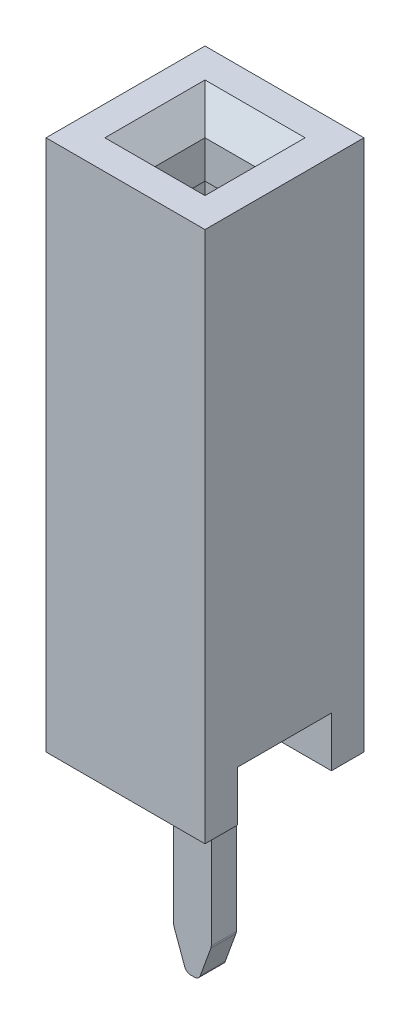
ISO-10303-21;
HEADER;
FILE_DESCRIPTION(('STEP AP214'),'2;1');
FILE_NAME('part.step','',(''),(''),'','','');
FILE_SCHEMA(('AUTOMOTIVE_DESIGN { 1 0 10303 214 1 1 1 1 }'));
ENDSEC;
DATA;
#1=APPLICATION_CONTEXT('core data for automotive mechanical design processes');
#2=APPLICATION_PROTOCOL_DEFINITION('international standard','automotive_design',2000,#1);
#3=PRODUCT_CONTEXT('',#1,'mechanical');
#4=PRODUCT('Part','Part','',(#3));
#5=PRODUCT_RELATED_PRODUCT_CATEGORY('part','',(#4));
#6=PRODUCT_DEFINITION_FORMATION('','',#4);
#7=PRODUCT_DEFINITION_CONTEXT('part definition',#1,'design');
#8=PRODUCT_DEFINITION('design','',#6,#7);
#9=PRODUCT_DEFINITION_SHAPE('','',#8);
#10=(LENGTH_UNIT() NAMED_UNIT(*) SI_UNIT(.MILLI.,.METRE.));
#11=(NAMED_UNIT(*) PLANE_ANGLE_UNIT() SI_UNIT($,.RADIAN.));
#12=(NAMED_UNIT(*) SI_UNIT($,.STERADIAN.) SOLID_ANGLE_UNIT());
#13=UNCERTAINTY_MEASURE_WITH_UNIT(LENGTH_MEASURE(1.E-05),#10,'distance_accuracy_value','');
#14=(GEOMETRIC_REPRESENTATION_CONTEXT(3) GLOBAL_UNCERTAINTY_ASSIGNED_CONTEXT((#13)) GLOBAL_UNIT_ASSIGNED_CONTEXT((#10,
#11,#12)) REPRESENTATION_CONTEXT('',''));
#15=CARTESIAN_POINT('',(0.,0.,0.));
#16=DIRECTION('',(0.,0.,1.));
#17=DIRECTION('',(1.,0.,0.));
#18=AXIS2_PLACEMENT_3D('',#15,#16,#17);
#19=CARTESIAN_POINT('',(0.3,-3.,-0.2));
#20=DIRECTION('',(1.,0.,0.));
#21=DIRECTION('',(0.,0.,-1.));
#22=AXIS2_PLACEMENT_3D('',#19,#20,#21);
#23=PLANE('',#22);
#24=DIRECTION('',(0.,1.,0.));
#25=VECTOR('',#24,1.);
#26=CARTESIAN_POINT('',(0.3,-3.,0.2));
#27=LINE('',#26,#25);
#28=CARTESIAN_POINT('',(0.3,-2.43287181803823,0.2));
#29=VERTEX_POINT('',#28);
#30=CARTESIAN_POINT('',(0.3,1.,0.2));
#31=VERTEX_POINT('',#30);
#32=EDGE_CURVE('E157',#29,#31,#27,.T.);
#33=ORIENTED_EDGE('',*,*,#32,.F.);
#34=DIRECTION('',(0.,0.,-1.));
#35=VECTOR('',#34,1.);
#36=CARTESIAN_POINT('',(0.3,-2.43287181803823,-0.2));
#37=LINE('',#36,#35);
#38=CARTESIAN_POINT('',(0.3,-2.43287181803823,-0.2));
#39=VERTEX_POINT('',#38);
#40=EDGE_CURVE('E55',#29,#39,#37,.T.);
#41=ORIENTED_EDGE('',*,*,#40,.T.);
#42=DIRECTION('',(0.,1.,0.));
#43=VECTOR('',#42,1.);
#44=CARTESIAN_POINT('',(0.3,-3.,-0.2));
#45=LINE('',#44,#43);
#46=CARTESIAN_POINT('',(0.3,1.,-0.2));
#47=VERTEX_POINT('',#46);
#48=EDGE_CURVE('E127',#39,#47,#45,.T.);
#49=ORIENTED_EDGE('',*,*,#48,.T.);
#50=DIRECTION('',(0.,0.,-1.));
#51=VECTOR('',#50,1.);
#52=CARTESIAN_POINT('',(0.3,1.,-0.2));
#53=LINE('',#52,#51);
#54=EDGE_CURVE('E130',#31,#47,#53,.T.);
#55=ORIENTED_EDGE('',*,*,#54,.F.);
#56=EDGE_LOOP('',(#33,#41,#49,#55));
#57=FACE_BOUND('',#56,.T.);
#58=ADVANCED_FACE('F47',(#57),#23,.T.);
#59=CARTESIAN_POINT('',(-0.3,-3.,0.2));
#60=DIRECTION('',(0.,0.,1.));
#61=DIRECTION('',(1.,0.,0.));
#62=AXIS2_PLACEMENT_3D('',#59,#60,#61);
#63=PLANE('',#62);
#64=DIRECTION('',(0.34202014332567,-0.939692620785908,0.));
#65=VECTOR('',#64,1.);
#66=CARTESIAN_POINT('',(-0.123395555688102,-2.93572123903135,0.2));
#67=LINE('',#66,#65);
#68=CARTESIAN_POINT('',(-0.293969262078591,-2.4670738323708,0.2));
#69=VERTEX_POINT('',#68);
#70=CARTESIAN_POINT('',(-0.12394850825762,-2.93420201433257,0.2));
#71=VERTEX_POINT('',#70);
#72=EDGE_CURVE('E164',#69,#71,#67,.T.);
#73=ORIENTED_EDGE('',*,*,#72,.T.);
#74=CARTESIAN_POINT('',(-0.0299792461790288,-2.9,0.2));
#75=DIRECTION('',(0.,0.,1.));
#76=DIRECTION('',(1.,0.,0.));
#77=AXIS2_PLACEMENT_3D('',#74,#75,#76);
#78=CIRCLE('',#77,0.1);
#79=CARTESIAN_POINT('',(-0.0299792461790288,-3.,0.2));
#80=VERTEX_POINT('',#79);
#81=EDGE_CURVE('E196',#71,#80,#78,.T.);
#82=ORIENTED_EDGE('',*,*,#81,.T.);
#83=DIRECTION('',(1.,0.,0.));
#84=VECTOR('',#83,1.);
#85=CARTESIAN_POINT('',(-0.3,-3.,0.2));
#86=LINE('',#85,#84);
#87=CARTESIAN_POINT('',(0.0299792461790288,-3.,0.2));
#88=VERTEX_POINT('',#87);
#89=EDGE_CURVE('E135',#80,#88,#86,.T.);
#90=ORIENTED_EDGE('',*,*,#89,.T.);
#91=CARTESIAN_POINT('',(0.0299792461790288,-2.9,0.2));
#92=DIRECTION('',(0.,0.,1.));
#93=DIRECTION('',(1.,0.,0.));
#94=AXIS2_PLACEMENT_3D('',#91,#92,#93);
#95=CIRCLE('',#94,0.1);
#96=CARTESIAN_POINT('',(0.12394850825762,-2.93420201433257,0.2));
#97=VERTEX_POINT('',#96);
#98=EDGE_CURVE('E194',#88,#97,#95,.T.);
#99=ORIENTED_EDGE('',*,*,#98,.T.);
#100=DIRECTION('',(0.34202014332567,0.939692620785908,0.));
#101=VECTOR('',#100,1.);
#102=CARTESIAN_POINT('',(0.0532088886237948,-3.12855752193731,0.2));
#103=LINE('',#102,#101);
#104=CARTESIAN_POINT('',(0.293969262078591,-2.4670738323708,0.2));
#105=VERTEX_POINT('',#104);
#106=EDGE_CURVE('E159',#97,#105,#103,.T.);
#107=ORIENTED_EDGE('',*,*,#106,.T.);
#108=CARTESIAN_POINT('',(0.2,-2.43287181803823,0.2));
#109=DIRECTION('',(0.,0.,1.));
#110=DIRECTION('',(1.,0.,0.));
#111=AXIS2_PLACEMENT_3D('',#108,#109,#110);
#112=CIRCLE('',#111,0.1);
#113=EDGE_CURVE('E62',#105,#29,#112,.T.);
#114=ORIENTED_EDGE('',*,*,#113,.T.);
#115=ORIENTED_EDGE('',*,*,#32,.T.);
#116=DIRECTION('',(1.,0.,0.));
#117=VECTOR('',#116,1.);
#118=CARTESIAN_POINT('',(-0.3,1.,0.2));
#119=LINE('',#118,#117);
#120=CARTESIAN_POINT('',(-0.3,1.,0.2));
#121=VERTEX_POINT('',#120);
#122=EDGE_CURVE('E149',#121,#31,#119,.T.);
#123=ORIENTED_EDGE('',*,*,#122,.F.);
#124=DIRECTION('',(0.,1.,0.));
#125=VECTOR('',#124,1.);
#126=CARTESIAN_POINT('',(-0.3,-3.,0.2));
#127=LINE('',#126,#125);
#128=CARTESIAN_POINT('',(-0.3,-2.43287181803823,0.2));
#129=VERTEX_POINT('',#128);
#130=EDGE_CURVE('E160',#129,#121,#127,.T.);
#131=ORIENTED_EDGE('',*,*,#130,.F.);
#132=CARTESIAN_POINT('',(-0.2,-2.43287181803823,0.2));
#133=DIRECTION('',(0.,0.,1.));
#134=DIRECTION('',(1.,0.,0.));
#135=AXIS2_PLACEMENT_3D('',#132,#133,#134);
#136=CIRCLE('',#135,0.1);
#137=EDGE_CURVE('E191',#129,#69,#136,.T.);
#138=ORIENTED_EDGE('',*,*,#137,.T.);
#139=EDGE_LOOP('',(#73,#82,#90,#99,#107,#114,#115,#123,#131,#138));
#140=FACE_BOUND('',#139,.T.);
#141=ADVANCED_FACE('F212',(#140),#63,.T.);
#142=CARTESIAN_POINT('',(-0.3,-3.,-0.2));
#143=DIRECTION('',(-1.,0.,0.));
#144=DIRECTION('',(0.,0.,1.));
#145=AXIS2_PLACEMENT_3D('',#142,#143,#144);
#146=PLANE('',#145);
#147=DIRECTION('',(0.,1.,0.));
#148=VECTOR('',#147,1.);
#149=CARTESIAN_POINT('',(-0.3,-3.,-0.2));
#150=LINE('',#149,#148);
#151=CARTESIAN_POINT('',(-0.3,-2.43287181803823,-0.2));
#152=VERTEX_POINT('',#151);
#153=CARTESIAN_POINT('',(-0.3,1.,-0.2));
#154=VERTEX_POINT('',#153);
#155=EDGE_CURVE('E134',#152,#154,#150,.T.);
#156=ORIENTED_EDGE('',*,*,#155,.F.);
#157=DIRECTION('',(0.,0.,1.));
#158=VECTOR('',#157,1.);
#159=CARTESIAN_POINT('',(-0.3,-2.43287181803823,-0.2));
#160=LINE('',#159,#158);
#161=EDGE_CURVE('E12',#152,#129,#160,.T.);
#162=ORIENTED_EDGE('',*,*,#161,.T.);
#163=ORIENTED_EDGE('',*,*,#130,.T.);
#164=DIRECTION('',(0.,0.,1.));
#165=VECTOR('',#164,1.);
#166=CARTESIAN_POINT('',(-0.3,1.,-0.2));
#167=LINE('',#166,#165);
#168=EDGE_CURVE('E145',#154,#121,#167,.T.);
#169=ORIENTED_EDGE('',*,*,#168,.F.);
#170=EDGE_LOOP('',(#156,#162,#163,#169));
#171=FACE_BOUND('',#170,.T.);
#172=ADVANCED_FACE('F237',(#171),#146,.T.);
#173=CARTESIAN_POINT('',(-0.3,-3.,-0.2));
#174=DIRECTION('',(0.,0.,-1.));
#175=DIRECTION('',(-1.,0.,0.));
#176=AXIS2_PLACEMENT_3D('',#173,#174,#175);
#177=PLANE('',#176);
#178=DIRECTION('',(-1.,0.,0.));
#179=VECTOR('',#178,1.);
#180=CARTESIAN_POINT('',(-0.3,-3.,-0.2));
#181=LINE('',#180,#179);
#182=CARTESIAN_POINT('',(0.0299792461790288,-3.,-0.2));
#183=VERTEX_POINT('',#182);
#184=CARTESIAN_POINT('',(-0.0299792461790288,-3.,-0.2));
#185=VERTEX_POINT('',#184);
#186=EDGE_CURVE('E156',#183,#185,#181,.T.);
#187=ORIENTED_EDGE('',*,*,#186,.T.);
#188=CARTESIAN_POINT('',(-0.0299792461790288,-2.9,-0.2));
#189=DIRECTION('',(0.,0.,-1.));
#190=DIRECTION('',(-1.,0.,0.));
#191=AXIS2_PLACEMENT_3D('',#188,#189,#190);
#192=CIRCLE('',#191,0.1);
#193=CARTESIAN_POINT('',(-0.12394850825762,-2.93420201433257,-0.2));
#194=VERTEX_POINT('',#193);
#195=EDGE_CURVE('E185',#185,#194,#192,.T.);
#196=ORIENTED_EDGE('',*,*,#195,.T.);
#197=DIRECTION('',(-0.34202014332567,0.939692620785908,0.));
#198=VECTOR('',#197,1.);
#199=CARTESIAN_POINT('',(-0.123395555688102,-2.93572123903135,-0.2));
#200=LINE('',#199,#198);
#201=CARTESIAN_POINT('',(-0.293969262078591,-2.4670738323708,-0.2));
#202=VERTEX_POINT('',#201);
#203=EDGE_CURVE('E170',#194,#202,#200,.T.);
#204=ORIENTED_EDGE('',*,*,#203,.T.);
#205=CARTESIAN_POINT('',(-0.2,-2.43287181803823,-0.2));
#206=DIRECTION('',(0.,0.,-1.));
#207=DIRECTION('',(-1.,0.,0.));
#208=AXIS2_PLACEMENT_3D('',#205,#206,#207);
#209=CIRCLE('',#208,0.1);
#210=EDGE_CURVE('E179',#202,#152,#209,.T.);
#211=ORIENTED_EDGE('',*,*,#210,.T.);
#212=ORIENTED_EDGE('',*,*,#155,.T.);
#213=DIRECTION('',(-1.,0.,0.));
#214=VECTOR('',#213,1.);
#215=CARTESIAN_POINT('',(-0.3,1.,-0.2));
#216=LINE('',#215,#214);
#217=EDGE_CURVE('E138',#47,#154,#216,.T.);
#218=ORIENTED_EDGE('',*,*,#217,.F.);
#219=ORIENTED_EDGE('',*,*,#48,.F.);
#220=CARTESIAN_POINT('',(0.2,-2.43287181803823,-0.2));
#221=DIRECTION('',(0.,0.,-1.));
#222=DIRECTION('',(-1.,0.,0.));
#223=AXIS2_PLACEMENT_3D('',#220,#221,#222);
#224=CIRCLE('',#223,0.1);
#225=CARTESIAN_POINT('',(0.293969262078591,-2.4670738323708,-0.2));
#226=VERTEX_POINT('',#225);
#227=EDGE_CURVE('E181',#39,#226,#224,.T.);
#228=ORIENTED_EDGE('',*,*,#227,.T.);
#229=DIRECTION('',(-0.34202014332567,-0.939692620785908,0.));
#230=VECTOR('',#229,1.);
#231=CARTESIAN_POINT('',(0.0532088886237948,-3.12855752193731,-0.2));
#232=LINE('',#231,#230);
#233=CARTESIAN_POINT('',(0.12394850825762,-2.93420201433257,-0.2));
#234=VERTEX_POINT('',#233);
#235=EDGE_CURVE('E167',#226,#234,#232,.T.);
#236=ORIENTED_EDGE('',*,*,#235,.T.);
#237=CARTESIAN_POINT('',(0.0299792461790288,-2.9,-0.2));
#238=DIRECTION('',(0.,0.,-1.));
#239=DIRECTION('',(-1.,0.,0.));
#240=AXIS2_PLACEMENT_3D('',#237,#238,#239);
#241=CIRCLE('',#240,0.1);
#242=EDGE_CURVE('E183',#234,#183,#241,.T.);
#243=ORIENTED_EDGE('',*,*,#242,.T.);
#244=EDGE_LOOP('',(#187,#196,#204,#211,#212,#218,#219,#228,#236,#243));
#245=FACE_BOUND('',#244,.T.);
#246=ADVANCED_FACE('F140',(#245),#177,.T.);
#247=CARTESIAN_POINT('',(0.,-3.,0.));
#248=DIRECTION('',(0.,1.,0.));
#249=DIRECTION('',(0.,0.,1.));
#250=AXIS2_PLACEMENT_3D('',#247,#248,#249);
#251=PLANE('',#250);
#252=ORIENTED_EDGE('',*,*,#89,.F.);
#253=DIRECTION('',(0.,0.,-1.));
#254=VECTOR('',#253,1.);
#255=CARTESIAN_POINT('',(-0.0299792461790288,-3.,-0.2));
#256=LINE('',#255,#254);
#257=EDGE_CURVE('E176',#80,#185,#256,.T.);
#258=ORIENTED_EDGE('',*,*,#257,.T.);
#259=ORIENTED_EDGE('',*,*,#186,.F.);
#260=DIRECTION('',(0.,0.,1.));
#261=VECTOR('',#260,1.);
#262=CARTESIAN_POINT('',(0.0299792461790288,-3.,0.2));
#263=LINE('',#262,#261);
#264=EDGE_CURVE('E173',#183,#88,#263,.T.);
#265=ORIENTED_EDGE('',*,*,#264,.T.);
#266=EDGE_LOOP('',(#252,#258,#259,#265));
#267=FACE_BOUND('',#266,.T.);
#268=ADVANCED_FACE('F210',(#267),#251,.F.);
#269=CARTESIAN_POINT('',(0.,1.,0.));
#270=DIRECTION('',(0.,1.,0.));
#271=DIRECTION('',(0.,0.,1.));
#272=AXIS2_PLACEMENT_3D('',#269,#270,#271);
#273=PLANE('',#272);
#274=ORIENTED_EDGE('',*,*,#54,.T.);
#275=ORIENTED_EDGE('',*,*,#217,.T.);
#276=ORIENTED_EDGE('',*,*,#168,.T.);
#277=ORIENTED_EDGE('',*,*,#122,.T.);
#278=EDGE_LOOP('',(#274,#275,#276,#277));
#279=FACE_BOUND('',#278,.T.);
#280=ADVANCED_FACE('F147',(#279),#273,.T.);
#281=CARTESIAN_POINT('',(-0.3,-2.45050451610908,-0.2));
#282=DIRECTION('',(-0.939692620785908,-0.34202014332567,0.));
#283=DIRECTION('',(0.,0.,-1.));
#284=AXIS2_PLACEMENT_3D('',#281,#282,#283);
#285=PLANE('',#284);
#286=ORIENTED_EDGE('',*,*,#203,.F.);
#287=DIRECTION('',(0.,0.,-1.));
#288=VECTOR('',#287,1.);
#289=CARTESIAN_POINT('',(-0.12394850825762,-2.93420201433257,0.2));
#290=LINE('',#289,#288);
#291=EDGE_CURVE('E189',#194,#71,#290,.F.);
#292=ORIENTED_EDGE('',*,*,#291,.T.);
#293=ORIENTED_EDGE('',*,*,#72,.F.);
#294=DIRECTION('',(0.,0.,1.));
#295=VECTOR('',#294,1.);
#296=CARTESIAN_POINT('',(-0.293969262078591,-2.4670738323708,-0.2));
#297=LINE('',#296,#295);
#298=EDGE_CURVE('E187',#69,#202,#297,.F.);
#299=ORIENTED_EDGE('',*,*,#298,.T.);
#300=EDGE_LOOP('',(#286,#292,#293,#299));
#301=FACE_BOUND('',#300,.T.);
#302=ADVANCED_FACE('F219',(#301),#285,.T.);
#303=CARTESIAN_POINT('',(0.3,-2.45050451610908,-0.2));
#304=DIRECTION('',(0.939692620785908,-0.34202014332567,0.));
#305=DIRECTION('',(0.,0.,1.));
#306=AXIS2_PLACEMENT_3D('',#303,#304,#305);
#307=PLANE('',#306);
#308=ORIENTED_EDGE('',*,*,#106,.F.);
#309=DIRECTION('',(0.,0.,1.));
#310=VECTOR('',#309,1.);
#311=CARTESIAN_POINT('',(0.12394850825762,-2.93420201433257,-0.2));
#312=LINE('',#311,#310);
#313=EDGE_CURVE('E199',#97,#234,#312,.F.);
#314=ORIENTED_EDGE('',*,*,#313,.T.);
#315=ORIENTED_EDGE('',*,*,#235,.F.);
#316=DIRECTION('',(0.,0.,-1.));
#317=VECTOR('',#316,1.);
#318=CARTESIAN_POINT('',(0.293969262078591,-2.4670738323708,-0.2));
#319=LINE('',#318,#317);
#320=EDGE_CURVE('E70',#226,#105,#319,.F.);
#321=ORIENTED_EDGE('',*,*,#320,.T.);
#322=EDGE_LOOP('',(#308,#314,#315,#321));
#323=FACE_BOUND('',#322,.T.);
#324=ADVANCED_FACE('F201',(#323),#307,.T.);
#325=CARTESIAN_POINT('',(-0.0299792461790288,-2.9,0.));
#326=DIRECTION('',(0.,0.,1.));
#327=DIRECTION('',(1.,0.,0.));
#328=AXIS2_PLACEMENT_3D('',#325,#326,#327);
#329=CYLINDRICAL_SURFACE('',#328,0.1);
#330=ORIENTED_EDGE('',*,*,#81,.F.);
#331=ORIENTED_EDGE('',*,*,#291,.F.);
#332=ORIENTED_EDGE('',*,*,#195,.F.);
#333=ORIENTED_EDGE('',*,*,#257,.F.);
#334=EDGE_LOOP('',(#330,#331,#332,#333));
#335=FACE_BOUND('',#334,.T.);
#336=ADVANCED_FACE('F222',(#335),#329,.T.);
#337=CARTESIAN_POINT('',(0.0299792461790288,-2.9,0.));
#338=DIRECTION('',(0.,0.,-1.));
#339=DIRECTION('',(-1.,0.,0.));
#340=AXIS2_PLACEMENT_3D('',#337,#338,#339);
#341=CYLINDRICAL_SURFACE('',#340,0.1);
#342=ORIENTED_EDGE('',*,*,#242,.F.);
#343=ORIENTED_EDGE('',*,*,#313,.F.);
#344=ORIENTED_EDGE('',*,*,#98,.F.);
#345=ORIENTED_EDGE('',*,*,#264,.F.);
#346=EDGE_LOOP('',(#342,#343,#344,#345));
#347=FACE_BOUND('',#346,.T.);
#348=ADVANCED_FACE('F206',(#347),#341,.T.);
#349=CARTESIAN_POINT('',(0.2,-2.43287181803823,-0.2));
#350=DIRECTION('',(0.,0.,-1.));
#351=DIRECTION('',(-1.,0.,0.));
#352=AXIS2_PLACEMENT_3D('',#349,#350,#351);
#353=CYLINDRICAL_SURFACE('',#352,0.1);
#354=ORIENTED_EDGE('',*,*,#113,.F.);
#355=ORIENTED_EDGE('',*,*,#320,.F.);
#356=ORIENTED_EDGE('',*,*,#227,.F.);
#357=ORIENTED_EDGE('',*,*,#40,.F.);
#358=EDGE_LOOP('',(#354,#355,#356,#357));
#359=FACE_BOUND('',#358,.T.);
#360=ADVANCED_FACE('F229',(#359),#353,.T.);
#361=CARTESIAN_POINT('',(-0.2,-2.43287181803823,-0.2));
#362=DIRECTION('',(0.,0.,1.));
#363=DIRECTION('',(1.,0.,0.));
#364=AXIS2_PLACEMENT_3D('',#361,#362,#363);
#365=CYLINDRICAL_SURFACE('',#364,0.1);
#366=ORIENTED_EDGE('',*,*,#210,.F.);
#367=ORIENTED_EDGE('',*,*,#298,.F.);
#368=ORIENTED_EDGE('',*,*,#137,.F.);
#369=ORIENTED_EDGE('',*,*,#161,.F.);
#370=EDGE_LOOP('',(#366,#367,#368,#369));
#371=FACE_BOUND('',#370,.T.);
#372=ADVANCED_FACE('F49',(#371),#365,.T.);
#373=CLOSED_SHELL('',(#58,#141,#172,#246,#268,#280,#302,#324,#336,#348,#360,#372));
#374=MANIFOLD_SOLID_BREP('B2',#373);
#375=CARTESIAN_POINT('',(0.,0.,0.));
#376=DIRECTION('',(0.,-1.,0.));
#377=DIRECTION('',(0.,0.,-1.));
#378=AXIS2_PLACEMENT_3D('',#375,#376,#377);
#379=PLANE('',#378);
#380=DIRECTION('',(1.,0.,0.));
#381=VECTOR('',#380,1.);
#382=CARTESIAN_POINT('',(-1.27,0.,-0.75));
#383=LINE('',#382,#381);
#384=CARTESIAN_POINT('',(-1.27,0.,-0.75));
#385=VERTEX_POINT('',#384);
#386=CARTESIAN_POINT('',(1.27,0.,-0.75));
#387=VERTEX_POINT('',#386);
#388=EDGE_CURVE('E490',#385,#387,#383,.T.);
#389=ORIENTED_EDGE('',*,*,#388,.F.);
#390=DIRECTION('',(0.,0.,1.));
#391=VECTOR('',#390,1.);
#392=CARTESIAN_POINT('',(-1.27,0.,1.27));
#393=LINE('',#392,#391);
#394=CARTESIAN_POINT('',(-1.27,0.,-1.27));
#395=VERTEX_POINT('',#394);
#396=EDGE_CURVE('E591',#395,#385,#393,.T.);
#397=ORIENTED_EDGE('',*,*,#396,.F.);
#398=DIRECTION('',(-1.,0.,0.));
#399=VECTOR('',#398,1.);
#400=CARTESIAN_POINT('',(-1.27,0.,-1.27));
#401=LINE('',#400,#399);
#402=CARTESIAN_POINT('',(1.27,0.,-1.27));
#403=VERTEX_POINT('',#402);
#404=EDGE_CURVE('E588',#403,#395,#401,.T.);
#405=ORIENTED_EDGE('',*,*,#404,.F.);
#406=DIRECTION('',(0.,0.,-1.));
#407=VECTOR('',#406,1.);
#408=CARTESIAN_POINT('',(1.27,0.,1.27));
#409=LINE('',#408,#407);
#410=EDGE_CURVE('E575',#387,#403,#409,.T.);
#411=ORIENTED_EDGE('',*,*,#410,.F.);
#412=EDGE_LOOP('',(#389,#397,#405,#411));
#413=FACE_BOUND('',#412,.T.);
#414=ADVANCED_FACE('F327',(#413),#379,.T.);
#415=CARTESIAN_POINT('',(0.4,1.,0.4));
#416=DIRECTION('',(1.,0.,0.));
#417=DIRECTION('',(0.,0.,-1.));
#418=AXIS2_PLACEMENT_3D('',#415,#416,#417);
#419=PLANE('',#418);
#420=DIRECTION('',(0.,0.,-1.));
#421=VECTOR('',#420,1.);
#422=CARTESIAN_POINT('',(0.4,7.5,0.4));
#423=LINE('',#422,#421);
#424=CARTESIAN_POINT('',(0.4,7.5,0.4));
#425=VERTEX_POINT('',#424);
#426=CARTESIAN_POINT('',(0.4,7.5,-0.4));
#427=VERTEX_POINT('',#426);
#428=EDGE_CURVE('E545',#425,#427,#423,.T.);
#429=ORIENTED_EDGE('',*,*,#428,.F.);
#430=DIRECTION('',(0.,1.,0.));
#431=VECTOR('',#430,1.);
#432=CARTESIAN_POINT('',(0.4,1.,0.4));
#433=LINE('',#432,#431);
#434=CARTESIAN_POINT('',(0.4,8.1,0.4));
#435=VERTEX_POINT('',#434);
#436=EDGE_CURVE('E548',#425,#435,#433,.T.);
#437=ORIENTED_EDGE('',*,*,#436,.T.);
#438=DIRECTION('',(0.,0.,-1.));
#439=VECTOR('',#438,1.);
#440=CARTESIAN_POINT('',(0.4,8.1,0.4));
#441=LINE('',#440,#439);
#442=CARTESIAN_POINT('',(0.4,8.1,-0.4));
#443=VERTEX_POINT('',#442);
#444=EDGE_CURVE('E607',#435,#443,#441,.T.);
#445=ORIENTED_EDGE('',*,*,#444,.T.);
#446=DIRECTION('',(0.,1.,0.));
#447=VECTOR('',#446,1.);
#448=CARTESIAN_POINT('',(0.4,1.,-0.4));
#449=LINE('',#448,#447);
#450=EDGE_CURVE('E555',#427,#443,#449,.T.);
#451=ORIENTED_EDGE('',*,*,#450,.F.);
#452=EDGE_LOOP('',(#429,#437,#445,#451));
#453=FACE_BOUND('',#452,.T.);
#454=ADVANCED_FACE('F675',(#453),#419,.F.);
#455=CARTESIAN_POINT('',(-0.4,1.,0.4));
#456=DIRECTION('',(0.,0.,1.));
#457=DIRECTION('',(1.,0.,0.));
#458=AXIS2_PLACEMENT_3D('',#455,#456,#457);
#459=PLANE('',#458);
#460=DIRECTION('',(1.,0.,0.));
#461=VECTOR('',#460,1.);
#462=CARTESIAN_POINT('',(-0.4,7.5,0.4));
#463=LINE('',#462,#461);
#464=CARTESIAN_POINT('',(-0.4,7.5,0.4));
#465=VERTEX_POINT('',#464);
#466=EDGE_CURVE('E543',#465,#425,#463,.T.);
#467=ORIENTED_EDGE('',*,*,#466,.F.);
#468=DIRECTION('',(0.,1.,0.));
#469=VECTOR('',#468,1.);
#470=CARTESIAN_POINT('',(-0.4,1.,0.4));
#471=LINE('',#470,#469);
#472=CARTESIAN_POINT('',(-0.4,8.1,0.4));
#473=VERTEX_POINT('',#472);
#474=EDGE_CURVE('E551',#465,#473,#471,.T.);
#475=ORIENTED_EDGE('',*,*,#474,.T.);
#476=DIRECTION('',(1.,0.,0.));
#477=VECTOR('',#476,1.);
#478=CARTESIAN_POINT('',(-0.4,8.1,0.4));
#479=LINE('',#478,#477);
#480=EDGE_CURVE('E619',#473,#435,#479,.T.);
#481=ORIENTED_EDGE('',*,*,#480,.T.);
#482=ORIENTED_EDGE('',*,*,#436,.F.);
#483=EDGE_LOOP('',(#467,#475,#481,#482));
#484=FACE_BOUND('',#483,.T.);
#485=ADVANCED_FACE('F673',(#484),#459,.F.);
#486=CARTESIAN_POINT('',(-0.4,1.,0.4));
#487=DIRECTION('',(-1.,0.,0.));
#488=DIRECTION('',(0.,0.,1.));
#489=AXIS2_PLACEMENT_3D('',#486,#487,#488);
#490=PLANE('',#489);
#491=DIRECTION('',(0.,0.,1.));
#492=VECTOR('',#491,1.);
#493=CARTESIAN_POINT('',(-0.4,7.5,0.4));
#494=LINE('',#493,#492);
#495=CARTESIAN_POINT('',(-0.4,7.5,-0.4));
#496=VERTEX_POINT('',#495);
#497=EDGE_CURVE('E541',#496,#465,#494,.T.);
#498=ORIENTED_EDGE('',*,*,#497,.F.);
#499=DIRECTION('',(0.,1.,0.));
#500=VECTOR('',#499,1.);
#501=CARTESIAN_POINT('',(-0.4,1.,-0.4));
#502=LINE('',#501,#500);
#503=CARTESIAN_POINT('',(-0.4,8.1,-0.4));
#504=VERTEX_POINT('',#503);
#505=EDGE_CURVE('E553',#496,#504,#502,.T.);
#506=ORIENTED_EDGE('',*,*,#505,.T.);
#507=DIRECTION('',(0.,0.,1.));
#508=VECTOR('',#507,1.);
#509=CARTESIAN_POINT('',(-0.4,8.1,0.4));
#510=LINE('',#509,#508);
#511=EDGE_CURVE('E622',#504,#473,#510,.T.);
#512=ORIENTED_EDGE('',*,*,#511,.T.);
#513=ORIENTED_EDGE('',*,*,#474,.F.);
#514=EDGE_LOOP('',(#498,#506,#512,#513));
#515=FACE_BOUND('',#514,.T.);
#516=ADVANCED_FACE('F647',(#515),#490,.F.);
#517=CARTESIAN_POINT('',(-0.4,1.,-0.4));
#518=DIRECTION('',(0.,0.,-1.));
#519=DIRECTION('',(-1.,0.,0.));
#520=AXIS2_PLACEMENT_3D('',#517,#518,#519);
#521=PLANE('',#520);
#522=DIRECTION('',(-1.,0.,0.));
#523=VECTOR('',#522,1.);
#524=CARTESIAN_POINT('',(-0.4,7.5,-0.4));
#525=LINE('',#524,#523);
#526=EDGE_CURVE('E335',#427,#496,#525,.T.);
#527=ORIENTED_EDGE('',*,*,#526,.F.);
#528=ORIENTED_EDGE('',*,*,#450,.T.);
#529=DIRECTION('',(-1.,0.,0.));
#530=VECTOR('',#529,1.);
#531=CARTESIAN_POINT('',(-0.4,8.1,-0.4));
#532=LINE('',#531,#530);
#533=EDGE_CURVE('E625',#443,#504,#532,.T.);
#534=ORIENTED_EDGE('',*,*,#533,.T.);
#535=ORIENTED_EDGE('',*,*,#505,.F.);
#536=EDGE_LOOP('',(#527,#528,#534,#535));
#537=FACE_BOUND('',#536,.T.);
#538=ADVANCED_FACE('F648',(#537),#521,.F.);
#539=CARTESIAN_POINT('',(0.,8.5,0.));
#540=DIRECTION('',(0.,-1.,0.));
#541=DIRECTION('',(0.,0.,-1.));
#542=AXIS2_PLACEMENT_3D('',#539,#540,#541);
#543=PLANE('',#542);
#544=DIRECTION('',(1.,0.,0.));
#545=VECTOR('',#544,1.);
#546=CARTESIAN_POINT('',(0.,8.5,-0.800000000000002));
#547=LINE('',#546,#545);
#548=CARTESIAN_POINT('',(-0.800000000000002,8.5,-0.800000000000002));
#549=VERTEX_POINT('',#548);
#550=CARTESIAN_POINT('',(0.800000000000002,8.5,-0.800000000000002));
#551=VERTEX_POINT('',#550);
#552=EDGE_CURVE('E610',#549,#551,#547,.T.);
#553=ORIENTED_EDGE('',*,*,#552,.T.);
#554=DIRECTION('',(0.,0.,1.));
#555=VECTOR('',#554,1.);
#556=CARTESIAN_POINT('',(0.800000000000002,8.5,0.));
#557=LINE('',#556,#555);
#558=CARTESIAN_POINT('',(0.800000000000002,8.5,0.800000000000002));
#559=VERTEX_POINT('',#558);
#560=EDGE_CURVE('E616',#551,#559,#557,.T.);
#561=ORIENTED_EDGE('',*,*,#560,.T.);
#562=DIRECTION('',(-1.,0.,0.));
#563=VECTOR('',#562,1.);
#564=CARTESIAN_POINT('',(0.,8.5,0.800000000000002));
#565=LINE('',#564,#563);
#566=CARTESIAN_POINT('',(-0.800000000000002,8.5,0.800000000000002));
#567=VERTEX_POINT('',#566);
#568=EDGE_CURVE('E614',#559,#567,#565,.T.);
#569=ORIENTED_EDGE('',*,*,#568,.T.);
#570=DIRECTION('',(0.,0.,-1.));
#571=VECTOR('',#570,1.);
#572=CARTESIAN_POINT('',(-0.800000000000002,8.5,0.));
#573=LINE('',#572,#571);
#574=EDGE_CURVE('E612',#567,#549,#573,.T.);
#575=ORIENTED_EDGE('',*,*,#574,.T.);
#576=EDGE_LOOP('',(#553,#561,#569,#575));
#577=FACE_BOUND('',#576,.T.);
#578=DIRECTION('',(0.,0.,-1.));
#579=VECTOR('',#578,1.);
#580=CARTESIAN_POINT('',(1.27,8.5,1.27));
#581=LINE('',#580,#579);
#582=CARTESIAN_POINT('',(1.27,8.5,1.27));
#583=VERTEX_POINT('',#582);
#584=CARTESIAN_POINT('',(1.27,8.5,-1.27));
#585=VERTEX_POINT('',#584);
#586=EDGE_CURVE('E576',#583,#585,#581,.T.);
#587=ORIENTED_EDGE('',*,*,#586,.T.);
#588=DIRECTION('',(-1.,0.,0.));
#589=VECTOR('',#588,1.);
#590=CARTESIAN_POINT('',(-1.27,8.5,-1.27));
#591=LINE('',#590,#589);
#592=CARTESIAN_POINT('',(-1.27,8.5,-1.27));
#593=VERTEX_POINT('',#592);
#594=EDGE_CURVE('E579',#585,#593,#591,.T.);
#595=ORIENTED_EDGE('',*,*,#594,.T.);
#596=DIRECTION('',(0.,0.,1.));
#597=VECTOR('',#596,1.);
#598=CARTESIAN_POINT('',(-1.27,8.5,1.27));
#599=LINE('',#598,#597);
#600=CARTESIAN_POINT('',(-1.27,8.5,1.27));
#601=VERTEX_POINT('',#600);
#602=EDGE_CURVE('E582',#593,#601,#599,.T.);
#603=ORIENTED_EDGE('',*,*,#602,.T.);
#604=DIRECTION('',(1.,0.,0.));
#605=VECTOR('',#604,1.);
#606=CARTESIAN_POINT('',(-1.27,8.5,1.27));
#607=LINE('',#606,#605);
#608=EDGE_CURVE('E584',#601,#583,#607,.T.);
#609=ORIENTED_EDGE('',*,*,#608,.T.);
#610=EDGE_LOOP('',(#587,#595,#603,#609));
#611=FACE_BOUND('',#610,.T.);
#612=ADVANCED_FACE('F662',(#577,#611),#543,.F.);
#613=DIRECTION('',(-1.,0.,0.));
#614=VECTOR('',#613,1.);
#615=CARTESIAN_POINT('',(-1.27,0.,0.75));
#616=LINE('',#615,#614);
#617=CARTESIAN_POINT('',(1.27,0.,0.75));
#618=VERTEX_POINT('',#617);
#619=CARTESIAN_POINT('',(-1.27,0.,0.75));
#620=VERTEX_POINT('',#619);
#621=EDGE_CURVE('E935',#618,#620,#616,.T.);
#622=ORIENTED_EDGE('',*,*,#621,.F.);
#623=CARTESIAN_POINT('',(1.27,0.,1.27));
#624=VERTEX_POINT('',#623);
#625=EDGE_CURVE('E496',#624,#618,#409,.T.);
#626=ORIENTED_EDGE('',*,*,#625,.F.);
#627=DIRECTION('',(1.,0.,0.));
#628=VECTOR('',#627,1.);
#629=CARTESIAN_POINT('',(-1.27,0.,1.27));
#630=LINE('',#629,#628);
#631=CARTESIAN_POINT('',(-1.27,0.,1.27));
#632=VERTEX_POINT('',#631);
#633=EDGE_CURVE('E580',#632,#624,#630,.T.);
#634=ORIENTED_EDGE('',*,*,#633,.F.);
#635=EDGE_CURVE('E590',#620,#632,#393,.T.);
#636=ORIENTED_EDGE('',*,*,#635,.F.);
#637=EDGE_LOOP('',(#622,#626,#634,#636));
#638=FACE_BOUND('',#637,.T.);
#639=ADVANCED_FACE('F685',(#638),#379,.T.);
#640=CARTESIAN_POINT('',(1.27,8.5,1.27));
#641=DIRECTION('',(-1.,0.,0.));
#642=DIRECTION('',(0.,0.,1.));
#643=AXIS2_PLACEMENT_3D('',#640,#641,#642);
#644=PLANE('',#643);
#645=DIRECTION('',(0.,0.,1.));
#646=VECTOR('',#645,1.);
#647=CARTESIAN_POINT('',(1.27,0.8,-0.75));
#648=LINE('',#647,#646);
#649=CARTESIAN_POINT('',(1.27,0.8,-0.75));
#650=VERTEX_POINT('',#649);
#651=CARTESIAN_POINT('',(1.27,0.8,0.75));
#652=VERTEX_POINT('',#651);
#653=EDGE_CURVE('E481',#650,#652,#648,.T.);
#654=ORIENTED_EDGE('',*,*,#653,.F.);
#655=DIRECTION('',(0.,-1.,0.));
#656=VECTOR('',#655,1.);
#657=CARTESIAN_POINT('',(1.27,0.8,-0.75));
#658=LINE('',#657,#656);
#659=EDGE_CURVE('E505',#650,#387,#658,.T.);
#660=ORIENTED_EDGE('',*,*,#659,.T.);
#661=ORIENTED_EDGE('',*,*,#410,.T.);
#662=DIRECTION('',(0.,-1.,0.));
#663=VECTOR('',#662,1.);
#664=CARTESIAN_POINT('',(1.27,8.5,-1.27));
#665=LINE('',#664,#663);
#666=EDGE_CURVE('E602',#585,#403,#665,.T.);
#667=ORIENTED_EDGE('',*,*,#666,.F.);
#668=ORIENTED_EDGE('',*,*,#586,.F.);
#669=DIRECTION('',(0.,-1.,0.));
#670=VECTOR('',#669,1.);
#671=CARTESIAN_POINT('',(1.27,8.5,1.27));
#672=LINE('',#671,#670);
#673=EDGE_CURVE('E586',#583,#624,#672,.T.);
#674=ORIENTED_EDGE('',*,*,#673,.T.);
#675=ORIENTED_EDGE('',*,*,#625,.T.);
#676=DIRECTION('',(0.,-1.,0.));
#677=VECTOR('',#676,1.);
#678=CARTESIAN_POINT('',(1.27,0.8,0.75));
#679=LINE('',#678,#677);
#680=EDGE_CURVE('E475',#652,#618,#679,.T.);
#681=ORIENTED_EDGE('',*,*,#680,.F.);
#682=EDGE_LOOP('',(#654,#660,#661,#667,#668,#674,#675,#681));
#683=FACE_BOUND('',#682,.T.);
#684=ADVANCED_FACE('F493',(#683),#644,.F.);
#685=CARTESIAN_POINT('',(-1.27,8.5,-1.27));
#686=DIRECTION('',(0.,0.,1.));
#687=DIRECTION('',(1.,0.,0.));
#688=AXIS2_PLACEMENT_3D('',#685,#686,#687);
#689=PLANE('',#688);
#690=ORIENTED_EDGE('',*,*,#404,.T.);
#691=DIRECTION('',(0.,-1.,0.));
#692=VECTOR('',#691,1.);
#693=CARTESIAN_POINT('',(-1.27,8.5,-1.27));
#694=LINE('',#693,#692);
#695=EDGE_CURVE('E599',#593,#395,#694,.T.);
#696=ORIENTED_EDGE('',*,*,#695,.F.);
#697=ORIENTED_EDGE('',*,*,#594,.F.);
#698=ORIENTED_EDGE('',*,*,#666,.T.);
#699=EDGE_LOOP('',(#690,#696,#697,#698));
#700=FACE_BOUND('',#699,.T.);
#701=ADVANCED_FACE('F717',(#700),#689,.F.);
#702=CARTESIAN_POINT('',(-1.27,8.5,1.27));
#703=DIRECTION('',(1.,0.,0.));
#704=DIRECTION('',(0.,0.,-1.));
#705=AXIS2_PLACEMENT_3D('',#702,#703,#704);
#706=PLANE('',#705);
#707=ORIENTED_EDGE('',*,*,#396,.T.);
#708=DIRECTION('',(0.,-1.,0.));
#709=VECTOR('',#708,1.);
#710=CARTESIAN_POINT('',(-1.27,0.8,-0.75));
#711=LINE('',#710,#709);
#712=CARTESIAN_POINT('',(-1.27,0.8,-0.75));
#713=VERTEX_POINT('',#712);
#714=EDGE_CURVE('E498',#713,#385,#711,.T.);
#715=ORIENTED_EDGE('',*,*,#714,.F.);
#716=DIRECTION('',(0.,0.,-1.));
#717=VECTOR('',#716,1.);
#718=CARTESIAN_POINT('',(-1.27,0.8,-0.75));
#719=LINE('',#718,#717);
#720=CARTESIAN_POINT('',(-1.27,0.8,0.75));
#721=VERTEX_POINT('',#720);
#722=EDGE_CURVE('E480',#721,#713,#719,.T.);
#723=ORIENTED_EDGE('',*,*,#722,.F.);
#724=DIRECTION('',(0.,-1.,0.));
#725=VECTOR('',#724,1.);
#726=CARTESIAN_POINT('',(-1.27,0.8,0.75));
#727=LINE('',#726,#725);
#728=EDGE_CURVE('E478',#721,#620,#727,.T.);
#729=ORIENTED_EDGE('',*,*,#728,.T.);
#730=ORIENTED_EDGE('',*,*,#635,.T.);
#731=DIRECTION('',(0.,-1.,0.));
#732=VECTOR('',#731,1.);
#733=CARTESIAN_POINT('',(-1.27,8.5,1.27));
#734=LINE('',#733,#732);
#735=EDGE_CURVE('E596',#601,#632,#734,.T.);
#736=ORIENTED_EDGE('',*,*,#735,.F.);
#737=ORIENTED_EDGE('',*,*,#602,.F.);
#738=ORIENTED_EDGE('',*,*,#695,.T.);
#739=EDGE_LOOP('',(#707,#715,#723,#729,#730,#736,#737,#738));
#740=FACE_BOUND('',#739,.T.);
#741=ADVANCED_FACE('F713',(#740),#706,.F.);
#742=CARTESIAN_POINT('',(-1.27,8.5,1.27));
#743=DIRECTION('',(0.,0.,-1.));
#744=DIRECTION('',(-1.,0.,0.));
#745=AXIS2_PLACEMENT_3D('',#742,#743,#744);
#746=PLANE('',#745);
#747=ORIENTED_EDGE('',*,*,#633,.T.);
#748=ORIENTED_EDGE('',*,*,#673,.F.);
#749=ORIENTED_EDGE('',*,*,#608,.F.);
#750=ORIENTED_EDGE('',*,*,#735,.T.);
#751=EDGE_LOOP('',(#747,#748,#749,#750));
#752=FACE_BOUND('',#751,.T.);
#753=ADVANCED_FACE('F705',(#752),#746,.F.);
#754=CARTESIAN_POINT('',(0.3,8.5,0.2));
#755=DIRECTION('',(-1.,0.,0.));
#756=DIRECTION('',(0.,0.,1.));
#757=AXIS2_PLACEMENT_3D('',#754,#755,#756);
#758=PLANE('',#757);
#759=DIRECTION('',(0.,0.,-1.));
#760=VECTOR('',#759,1.);
#761=CARTESIAN_POINT('',(0.3,0.8,0.2));
#762=LINE('',#761,#760);
#763=CARTESIAN_POINT('',(0.3,0.8,0.2));
#764=VERTEX_POINT('',#763);
#765=CARTESIAN_POINT('',(0.3,0.8,-0.2));
#766=VERTEX_POINT('',#765);
#767=EDGE_CURVE('E507',#764,#766,#762,.T.);
#768=ORIENTED_EDGE('',*,*,#767,.F.);
#769=DIRECTION('',(0.,-1.,0.));
#770=VECTOR('',#769,1.);
#771=CARTESIAN_POINT('',(0.3,8.5,0.2));
#772=LINE('',#771,#770);
#773=CARTESIAN_POINT('',(0.3,1.,0.2));
#774=VERTEX_POINT('',#773);
#775=EDGE_CURVE('E563',#774,#764,#772,.T.);
#776=ORIENTED_EDGE('',*,*,#775,.F.);
#777=DIRECTION('',(0.,0.,1.));
#778=VECTOR('',#777,1.);
#779=CARTESIAN_POINT('',(0.3,1.,0.2));
#780=LINE('',#779,#778);
#781=CARTESIAN_POINT('',(0.3,1.,-0.2));
#782=VERTEX_POINT('',#781);
#783=EDGE_CURVE('E561',#782,#774,#780,.T.);
#784=ORIENTED_EDGE('',*,*,#783,.F.);
#785=DIRECTION('',(0.,-1.,0.));
#786=VECTOR('',#785,1.);
#787=CARTESIAN_POINT('',(0.3,8.5,-0.2));
#788=LINE('',#787,#786);
#789=EDGE_CURVE('E572',#782,#766,#788,.T.);
#790=ORIENTED_EDGE('',*,*,#789,.T.);
#791=EDGE_LOOP('',(#768,#776,#784,#790));
#792=FACE_BOUND('',#791,.T.);
#793=ADVANCED_FACE('F701',(#792),#758,.T.);
#794=CARTESIAN_POINT('',(-0.3,8.5,-0.2));
#795=DIRECTION('',(0.,0.,1.));
#796=DIRECTION('',(1.,0.,0.));
#797=AXIS2_PLACEMENT_3D('',#794,#795,#796);
#798=PLANE('',#797);
#799=DIRECTION('',(-1.,0.,0.));
#800=VECTOR('',#799,1.);
#801=CARTESIAN_POINT('',(-0.3,0.8,-0.2));
#802=LINE('',#801,#800);
#803=CARTESIAN_POINT('',(-0.3,0.8,-0.2));
#804=VERTEX_POINT('',#803);
#805=EDGE_CURVE('E504',#766,#804,#802,.T.);
#806=ORIENTED_EDGE('',*,*,#805,.F.);
#807=ORIENTED_EDGE('',*,*,#789,.F.);
#808=DIRECTION('',(1.,0.,0.));
#809=VECTOR('',#808,1.);
#810=CARTESIAN_POINT('',(-0.3,1.,-0.2));
#811=LINE('',#810,#809);
#812=CARTESIAN_POINT('',(-0.3,1.,-0.2));
#813=VERTEX_POINT('',#812);
#814=EDGE_CURVE('E559',#813,#782,#811,.T.);
#815=ORIENTED_EDGE('',*,*,#814,.F.);
#816=DIRECTION('',(0.,-1.,0.));
#817=VECTOR('',#816,1.);
#818=CARTESIAN_POINT('',(-0.3,8.5,-0.2));
#819=LINE('',#818,#817);
#820=EDGE_CURVE('E569',#813,#804,#819,.T.);
#821=ORIENTED_EDGE('',*,*,#820,.T.);
#822=EDGE_LOOP('',(#806,#807,#815,#821));
#823=FACE_BOUND('',#822,.T.);
#824=ADVANCED_FACE('F697',(#823),#798,.T.);
#825=CARTESIAN_POINT('',(-0.3,8.5,0.2));
#826=DIRECTION('',(1.,0.,0.));
#827=DIRECTION('',(0.,0.,-1.));
#828=AXIS2_PLACEMENT_3D('',#825,#826,#827);
#829=PLANE('',#828);
#830=DIRECTION('',(0.,0.,1.));
#831=VECTOR('',#830,1.);
#832=CARTESIAN_POINT('',(-0.3,0.8,0.2));
#833=LINE('',#832,#831);
#834=CARTESIAN_POINT('',(-0.3,0.8,0.2));
#835=VERTEX_POINT('',#834);
#836=EDGE_CURVE('E349',#804,#835,#833,.T.);
#837=ORIENTED_EDGE('',*,*,#836,.F.);
#838=ORIENTED_EDGE('',*,*,#820,.F.);
#839=DIRECTION('',(0.,0.,-1.));
#840=VECTOR('',#839,1.);
#841=CARTESIAN_POINT('',(-0.3,1.,0.2));
#842=LINE('',#841,#840);
#843=CARTESIAN_POINT('',(-0.3,1.,0.2));
#844=VERTEX_POINT('',#843);
#845=EDGE_CURVE('E550',#844,#813,#842,.T.);
#846=ORIENTED_EDGE('',*,*,#845,.F.);
#847=DIRECTION('',(0.,-1.,0.));
#848=VECTOR('',#847,1.);
#849=CARTESIAN_POINT('',(-0.3,8.5,0.2));
#850=LINE('',#849,#848);
#851=EDGE_CURVE('E566',#844,#835,#850,.T.);
#852=ORIENTED_EDGE('',*,*,#851,.T.);
#853=EDGE_LOOP('',(#837,#838,#846,#852));
#854=FACE_BOUND('',#853,.T.);
#855=ADVANCED_FACE('F693',(#854),#829,.T.);
#856=CARTESIAN_POINT('',(-0.3,8.5,0.2));
#857=DIRECTION('',(0.,0.,-1.));
#858=DIRECTION('',(-1.,0.,0.));
#859=AXIS2_PLACEMENT_3D('',#856,#857,#858);
#860=PLANE('',#859);
#861=DIRECTION('',(1.,0.,0.));
#862=VECTOR('',#861,1.);
#863=CARTESIAN_POINT('',(-0.3,0.8,0.2));
#864=LINE('',#863,#862);
#865=EDGE_CURVE('E45',#835,#764,#864,.T.);
#866=ORIENTED_EDGE('',*,*,#865,.F.);
#867=ORIENTED_EDGE('',*,*,#851,.F.);
#868=DIRECTION('',(-1.,0.,0.));
#869=VECTOR('',#868,1.);
#870=CARTESIAN_POINT('',(-0.3,1.,0.2));
#871=LINE('',#870,#869);
#872=EDGE_CURVE('E605',#774,#844,#871,.T.);
#873=ORIENTED_EDGE('',*,*,#872,.F.);
#874=ORIENTED_EDGE('',*,*,#775,.T.);
#875=EDGE_LOOP('',(#866,#867,#873,#874));
#876=FACE_BOUND('',#875,.T.);
#877=ADVANCED_FACE('F689',(#876),#860,.T.);
#878=CARTESIAN_POINT('',(0.,1.,0.));
#879=DIRECTION('',(0.,-1.,0.));
#880=DIRECTION('',(0.,0.,-1.));
#881=AXIS2_PLACEMENT_3D('',#878,#879,#880);
#882=PLANE('',#881);
#883=ORIENTED_EDGE('',*,*,#783,.T.);
#884=ORIENTED_EDGE('',*,*,#872,.T.);
#885=ORIENTED_EDGE('',*,*,#845,.T.);
#886=ORIENTED_EDGE('',*,*,#814,.T.);
#887=EDGE_LOOP('',(#883,#884,#885,#886));
#888=FACE_BOUND('',#887,.T.);
#889=DIRECTION('',(0.,0.,-1.));
#890=VECTOR('',#889,1.);
#891=CARTESIAN_POINT('',(0.800000000000002,1.,0.800000000000002));
#892=LINE('',#891,#890);
#893=CARTESIAN_POINT('',(0.800000000000002,1.,0.800000000000002));
#894=VERTEX_POINT('',#893);
#895=CARTESIAN_POINT('',(0.800000000000002,1.,-0.800000000000002));
#896=VERTEX_POINT('',#895);
#897=EDGE_CURVE('E525',#894,#896,#892,.T.);
#898=ORIENTED_EDGE('',*,*,#897,.T.);
#899=DIRECTION('',(-1.,0.,0.));
#900=VECTOR('',#899,1.);
#901=CARTESIAN_POINT('',(-0.800000000000002,1.,-0.800000000000002));
#902=LINE('',#901,#900);
#903=CARTESIAN_POINT('',(-0.800000000000002,1.,-0.800000000000002));
#904=VERTEX_POINT('',#903);
#905=EDGE_CURVE('E513',#896,#904,#902,.T.);
#906=ORIENTED_EDGE('',*,*,#905,.T.);
#907=DIRECTION('',(0.,0.,1.));
#908=VECTOR('',#907,1.);
#909=CARTESIAN_POINT('',(-0.800000000000002,1.,0.800000000000002));
#910=LINE('',#909,#908);
#911=CARTESIAN_POINT('',(-0.800000000000002,1.,0.800000000000002));
#912=VERTEX_POINT('',#911);
#913=EDGE_CURVE('E534',#904,#912,#910,.T.);
#914=ORIENTED_EDGE('',*,*,#913,.T.);
#915=DIRECTION('',(1.,0.,0.));
#916=VECTOR('',#915,1.);
#917=CARTESIAN_POINT('',(-0.800000000000002,1.,0.800000000000002));
#918=LINE('',#917,#916);
#919=EDGE_CURVE('E530',#912,#894,#918,.T.);
#920=ORIENTED_EDGE('',*,*,#919,.T.);
#921=EDGE_LOOP('',(#898,#906,#914,#920));
#922=FACE_BOUND('',#921,.T.);
#923=ADVANCED_FACE('F692',(#888,#922),#882,.F.);
#924=CARTESIAN_POINT('',(-0.4,8.1,0.4));
#925=DIRECTION('',(-0.707106781186547,-0.707106781186548,0.));
#926=DIRECTION('',(0.,0.,1.));
#927=AXIS2_PLACEMENT_3D('',#924,#925,#926);
#928=PLANE('',#927);
#929=DIRECTION('',(0.577350269189626,-0.577350269189625,0.577350269189626));
#930=VECTOR('',#929,1.);
#931=CARTESIAN_POINT('',(-0.133333333333333,7.83333333333333,-0.133333333333333));
#932=LINE('',#931,#930);
#933=EDGE_CURVE('E632',#549,#504,#932,.T.);
#934=ORIENTED_EDGE('',*,*,#933,.F.);
#935=ORIENTED_EDGE('',*,*,#574,.F.);
#936=DIRECTION('',(0.577350269189626,-0.577350269189625,-0.577350269189626));
#937=VECTOR('',#936,1.);
#938=CARTESIAN_POINT('',(-0.4,8.1,0.4));
#939=LINE('',#938,#937);
#940=EDGE_CURVE('E557',#473,#567,#939,.F.);
#941=ORIENTED_EDGE('',*,*,#940,.F.);
#942=ORIENTED_EDGE('',*,*,#511,.F.);
#943=EDGE_LOOP('',(#934,#935,#941,#942));
#944=FACE_BOUND('',#943,.T.);
#945=ADVANCED_FACE('F329',(#944),#928,.F.);
#946=CARTESIAN_POINT('',(-0.4,8.1,0.4));
#947=DIRECTION('',(0.,-0.707106781186548,0.707106781186547));
#948=DIRECTION('',(1.,0.,0.));
#949=AXIS2_PLACEMENT_3D('',#946,#947,#948);
#950=PLANE('',#949);
#951=ORIENTED_EDGE('',*,*,#940,.T.);
#952=ORIENTED_EDGE('',*,*,#568,.F.);
#953=DIRECTION('',(-0.577350269189626,-0.577350269189625,-0.577350269189626));
#954=VECTOR('',#953,1.);
#955=CARTESIAN_POINT('',(0.4,8.1,0.4));
#956=LINE('',#955,#954);
#957=EDGE_CURVE('E630',#435,#559,#956,.F.);
#958=ORIENTED_EDGE('',*,*,#957,.F.);
#959=ORIENTED_EDGE('',*,*,#480,.F.);
#960=EDGE_LOOP('',(#951,#952,#958,#959));
#961=FACE_BOUND('',#960,.T.);
#962=ADVANCED_FACE('F670',(#961),#950,.F.);
#963=CARTESIAN_POINT('',(-0.4,8.1,-0.4));
#964=DIRECTION('',(0.,-0.707106781186548,-0.707106781186547));
#965=DIRECTION('',(-1.,0.,0.));
#966=AXIS2_PLACEMENT_3D('',#963,#964,#965);
#967=PLANE('',#966);
#968=ORIENTED_EDGE('',*,*,#933,.T.);
#969=ORIENTED_EDGE('',*,*,#533,.F.);
#970=DIRECTION('',(0.577350269189626,0.577350269189625,-0.577350269189626));
#971=VECTOR('',#970,1.);
#972=CARTESIAN_POINT('',(0.133333333333333,7.83333333333333,-0.133333333333333));
#973=LINE('',#972,#971);
#974=EDGE_CURVE('E547',#551,#443,#973,.F.);
#975=ORIENTED_EDGE('',*,*,#974,.F.);
#976=ORIENTED_EDGE('',*,*,#552,.F.);
#977=EDGE_LOOP('',(#968,#969,#975,#976));
#978=FACE_BOUND('',#977,.T.);
#979=ADVANCED_FACE('F659',(#978),#967,.F.);
#980=CARTESIAN_POINT('',(0.4,8.1,0.4));
#981=DIRECTION('',(0.707106781186547,-0.707106781186548,0.));
#982=DIRECTION('',(0.,0.,-1.));
#983=AXIS2_PLACEMENT_3D('',#980,#981,#982);
#984=PLANE('',#983);
#985=ORIENTED_EDGE('',*,*,#957,.T.);
#986=ORIENTED_EDGE('',*,*,#560,.F.);
#987=ORIENTED_EDGE('',*,*,#974,.T.);
#988=ORIENTED_EDGE('',*,*,#444,.F.);
#989=EDGE_LOOP('',(#985,#986,#987,#988));
#990=FACE_BOUND('',#989,.T.);
#991=ADVANCED_FACE('F665',(#990),#984,.F.);
#992=CARTESIAN_POINT('',(0.,7.5,0.));
#993=DIRECTION('',(0.,-1.,0.));
#994=DIRECTION('',(0.,0.,-1.));
#995=AXIS2_PLACEMENT_3D('',#992,#993,#994);
#996=PLANE('',#995);
#997=DIRECTION('',(0.,0.,-1.));
#998=VECTOR('',#997,1.);
#999=CARTESIAN_POINT('',(0.800000000000002,7.5,0.800000000000002));
#1000=LINE('',#999,#998);
#1001=CARTESIAN_POINT('',(0.800000000000002,7.5,0.800000000000002));
#1002=VERTEX_POINT('',#1001);
#1003=CARTESIAN_POINT('',(0.800000000000002,7.5,-0.800000000000002));
#1004=VERTEX_POINT('',#1003);
#1005=EDGE_CURVE('E509',#1002,#1004,#1000,.T.);
#1006=ORIENTED_EDGE('',*,*,#1005,.F.);
#1007=DIRECTION('',(1.,0.,0.));
#1008=VECTOR('',#1007,1.);
#1009=CARTESIAN_POINT('',(-0.800000000000002,7.5,0.800000000000002));
#1010=LINE('',#1009,#1008);
#1011=CARTESIAN_POINT('',(-0.800000000000002,7.5,0.800000000000002));
#1012=VERTEX_POINT('',#1011);
#1013=EDGE_CURVE('E510',#1012,#1002,#1010,.T.);
#1014=ORIENTED_EDGE('',*,*,#1013,.F.);
#1015=DIRECTION('',(0.,0.,1.));
#1016=VECTOR('',#1015,1.);
#1017=CARTESIAN_POINT('',(-0.800000000000002,7.5,0.800000000000002));
#1018=LINE('',#1017,#1016);
#1019=CARTESIAN_POINT('',(-0.800000000000002,7.5,-0.800000000000002));
#1020=VERTEX_POINT('',#1019);
#1021=EDGE_CURVE('E514',#1020,#1012,#1018,.T.);
#1022=ORIENTED_EDGE('',*,*,#1021,.F.);
#1023=DIRECTION('',(-1.,0.,0.));
#1024=VECTOR('',#1023,1.);
#1025=CARTESIAN_POINT('',(-0.800000000000002,7.5,-0.800000000000002));
#1026=LINE('',#1025,#1024);
#1027=EDGE_CURVE('E517',#1004,#1020,#1026,.T.);
#1028=ORIENTED_EDGE('',*,*,#1027,.F.);
#1029=EDGE_LOOP('',(#1006,#1014,#1022,#1028));
#1030=FACE_BOUND('',#1029,.T.);
#1031=ORIENTED_EDGE('',*,*,#428,.T.);
#1032=ORIENTED_EDGE('',*,*,#526,.T.);
#1033=ORIENTED_EDGE('',*,*,#497,.T.);
#1034=ORIENTED_EDGE('',*,*,#466,.T.);
#1035=EDGE_LOOP('',(#1031,#1032,#1033,#1034));
#1036=FACE_BOUND('',#1035,.T.);
#1037=ADVANCED_FACE('F639',(#1030,#1036),#996,.T.);
#1038=CARTESIAN_POINT('',(-0.800000000000002,-1.26274169979696,-0.800000000000002));
#1039=DIRECTION('',(0.,0.,-1.));
#1040=DIRECTION('',(-1.,0.,0.));
#1041=AXIS2_PLACEMENT_3D('',#1038,#1039,#1040);
#1042=PLANE('',#1041);
#1043=DIRECTION('',(0.,1.,0.));
#1044=VECTOR('',#1043,1.);
#1045=CARTESIAN_POINT('',(0.800000000000002,-1.26274169979696,-0.800000000000002));
#1046=LINE('',#1045,#1044);
#1047=EDGE_CURVE('E528',#896,#1004,#1046,.T.);
#1048=ORIENTED_EDGE('',*,*,#1047,.T.);
#1049=ORIENTED_EDGE('',*,*,#1027,.T.);
#1050=DIRECTION('',(0.,1.,0.));
#1051=VECTOR('',#1050,1.);
#1052=CARTESIAN_POINT('',(-0.800000000000002,-1.26274169979696,-0.800000000000002));
#1053=LINE('',#1052,#1051);
#1054=EDGE_CURVE('E524',#904,#1020,#1053,.T.);
#1055=ORIENTED_EDGE('',*,*,#1054,.F.);
#1056=ORIENTED_EDGE('',*,*,#905,.F.);
#1057=EDGE_LOOP('',(#1048,#1049,#1055,#1056));
#1058=FACE_BOUND('',#1057,.T.);
#1059=ADVANCED_FACE('F740',(#1058),#1042,.F.);
#1060=CARTESIAN_POINT('',(-0.800000000000002,-1.26274169979696,0.800000000000002));
#1061=DIRECTION('',(-1.,0.,0.));
#1062=DIRECTION('',(0.,0.,1.));
#1063=AXIS2_PLACEMENT_3D('',#1060,#1061,#1062);
#1064=PLANE('',#1063);
#1065=ORIENTED_EDGE('',*,*,#1054,.T.);
#1066=ORIENTED_EDGE('',*,*,#1021,.T.);
#1067=DIRECTION('',(0.,1.,0.));
#1068=VECTOR('',#1067,1.);
#1069=CARTESIAN_POINT('',(-0.800000000000002,-1.26274169979696,0.800000000000002));
#1070=LINE('',#1069,#1068);
#1071=EDGE_CURVE('E533',#912,#1012,#1070,.T.);
#1072=ORIENTED_EDGE('',*,*,#1071,.F.);
#1073=ORIENTED_EDGE('',*,*,#913,.F.);
#1074=EDGE_LOOP('',(#1065,#1066,#1072,#1073));
#1075=FACE_BOUND('',#1074,.T.);
#1076=ADVANCED_FACE('F831',(#1075),#1064,.F.);
#1077=CARTESIAN_POINT('',(-0.800000000000002,-1.26274169979696,0.800000000000002));
#1078=DIRECTION('',(0.,0.,1.));
#1079=DIRECTION('',(1.,0.,0.));
#1080=AXIS2_PLACEMENT_3D('',#1077,#1078,#1079);
#1081=PLANE('',#1080);
#1082=ORIENTED_EDGE('',*,*,#1071,.T.);
#1083=ORIENTED_EDGE('',*,*,#1013,.T.);
#1084=DIRECTION('',(0.,1.,0.));
#1085=VECTOR('',#1084,1.);
#1086=CARTESIAN_POINT('',(0.800000000000002,-1.26274169979696,0.800000000000002));
#1087=LINE('',#1086,#1085);
#1088=EDGE_CURVE('E529',#894,#1002,#1087,.T.);
#1089=ORIENTED_EDGE('',*,*,#1088,.F.);
#1090=ORIENTED_EDGE('',*,*,#919,.F.);
#1091=EDGE_LOOP('',(#1082,#1083,#1089,#1090));
#1092=FACE_BOUND('',#1091,.T.);
#1093=ADVANCED_FACE('F828',(#1092),#1081,.F.);
#1094=CARTESIAN_POINT('',(0.800000000000002,-1.26274169979696,0.800000000000002));
#1095=DIRECTION('',(1.,0.,0.));
#1096=DIRECTION('',(0.,0.,-1.));
#1097=AXIS2_PLACEMENT_3D('',#1094,#1095,#1096);
#1098=PLANE('',#1097);
#1099=ORIENTED_EDGE('',*,*,#1088,.T.);
#1100=ORIENTED_EDGE('',*,*,#1005,.T.);
#1101=ORIENTED_EDGE('',*,*,#1047,.F.);
#1102=ORIENTED_EDGE('',*,*,#897,.F.);
#1103=EDGE_LOOP('',(#1099,#1100,#1101,#1102));
#1104=FACE_BOUND('',#1103,.T.);
#1105=ADVANCED_FACE('F800',(#1104),#1098,.F.);
#1106=CARTESIAN_POINT('',(-1.27,0.8,-0.75));
#1107=DIRECTION('',(0.,0.,-1.));
#1108=DIRECTION('',(-1.,0.,0.));
#1109=AXIS2_PLACEMENT_3D('',#1106,#1107,#1108);
#1110=PLANE('',#1109);
#1111=ORIENTED_EDGE('',*,*,#388,.T.);
#1112=ORIENTED_EDGE('',*,*,#659,.F.);
#1113=DIRECTION('',(1.,0.,0.));
#1114=VECTOR('',#1113,1.);
#1115=CARTESIAN_POINT('',(-1.27,0.8,-0.75));
#1116=LINE('',#1115,#1114);
#1117=EDGE_CURVE('E487',#713,#650,#1116,.T.);
#1118=ORIENTED_EDGE('',*,*,#1117,.F.);
#1119=ORIENTED_EDGE('',*,*,#714,.T.);
#1120=EDGE_LOOP('',(#1111,#1112,#1118,#1119));
#1121=FACE_BOUND('',#1120,.T.);
#1122=ADVANCED_FACE('F795',(#1121),#1110,.F.);
#1123=CARTESIAN_POINT('',(-1.27,0.8,0.75));
#1124=DIRECTION('',(0.,0.,1.));
#1125=DIRECTION('',(1.,0.,0.));
#1126=AXIS2_PLACEMENT_3D('',#1123,#1124,#1125);
#1127=PLANE('',#1126);
#1128=ORIENTED_EDGE('',*,*,#621,.T.);
#1129=ORIENTED_EDGE('',*,*,#728,.F.);
#1130=DIRECTION('',(-1.,0.,0.));
#1131=VECTOR('',#1130,1.);
#1132=CARTESIAN_POINT('',(-1.27,0.8,0.75));
#1133=LINE('',#1132,#1131);
#1134=EDGE_CURVE('E342',#652,#721,#1133,.T.);
#1135=ORIENTED_EDGE('',*,*,#1134,.F.);
#1136=ORIENTED_EDGE('',*,*,#680,.T.);
#1137=EDGE_LOOP('',(#1128,#1129,#1135,#1136));
#1138=FACE_BOUND('',#1137,.T.);
#1139=ADVANCED_FACE('F473',(#1138),#1127,.F.);
#1140=CARTESIAN_POINT('',(0.,0.8,0.));
#1141=DIRECTION('',(0.,1.,0.));
#1142=DIRECTION('',(0.,0.,1.));
#1143=AXIS2_PLACEMENT_3D('',#1140,#1141,#1142);
#1144=PLANE('',#1143);
#1145=ORIENTED_EDGE('',*,*,#767,.T.);
#1146=ORIENTED_EDGE('',*,*,#805,.T.);
#1147=ORIENTED_EDGE('',*,*,#836,.T.);
#1148=ORIENTED_EDGE('',*,*,#865,.T.);
#1149=EDGE_LOOP('',(#1145,#1146,#1147,#1148));
#1150=FACE_BOUND('',#1149,.T.);
#1151=ORIENTED_EDGE('',*,*,#653,.T.);
#1152=ORIENTED_EDGE('',*,*,#1134,.T.);
#1153=ORIENTED_EDGE('',*,*,#722,.T.);
#1154=ORIENTED_EDGE('',*,*,#1117,.T.);
#1155=EDGE_LOOP('',(#1151,#1152,#1153,#1154));
#1156=FACE_BOUND('',#1155,.T.);
#1157=ADVANCED_FACE('F485',(#1150,#1156),#1144,.F.);
#1158=CLOSED_SHELL('',(#414,#454,#485,#516,#538,#612,#639,#684,#701,#741,#753,#793,#824,#855,
#877,#923,#945,#962,#979,#991,#1037,#1059,#1076,#1093,#1105,#1122,#1139,#1157));
#1159=MANIFOLD_SOLID_BREP('B6',#1158);
#1160=ADVANCED_BREP_SHAPE_REPRESENTATION('',(#18,#374,#1159),#14);
#1161=SHAPE_DEFINITION_REPRESENTATION(#9,#1160);
ENDSEC;
END-ISO-10303-21;
